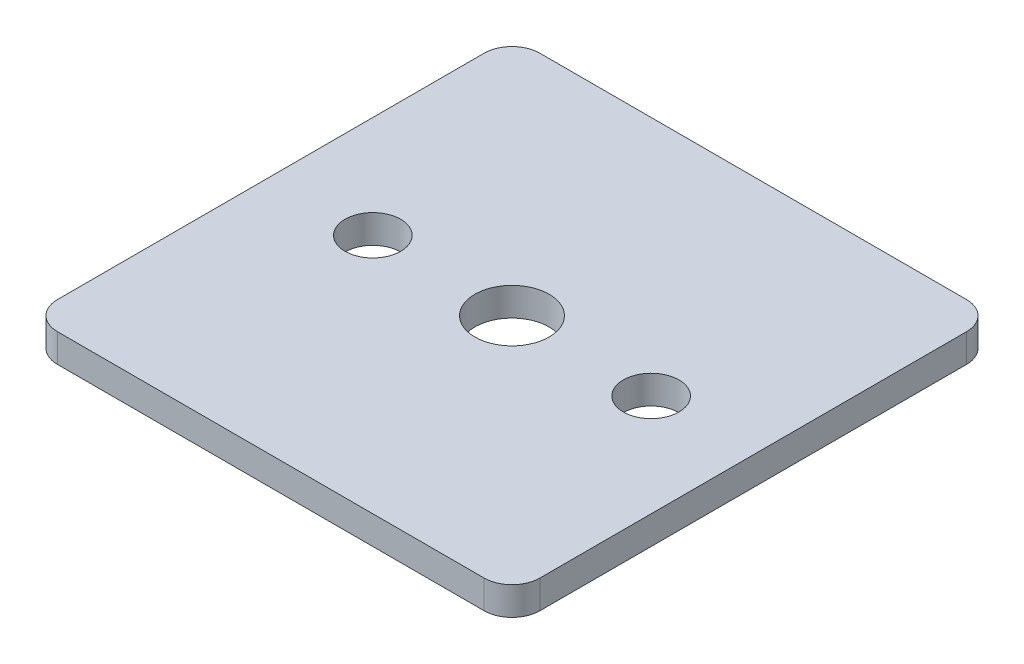
ISO-10303-21;
HEADER;
FILE_DESCRIPTION(('STEP AP214'),'2;1');
FILE_NAME('part.step','',(''),(''),'','','');
FILE_SCHEMA(('AUTOMOTIVE_DESIGN { 1 0 10303 214 1 1 1 1 }'));
ENDSEC;
DATA;
#1=APPLICATION_CONTEXT('core data for automotive mechanical design processes');
#2=APPLICATION_PROTOCOL_DEFINITION('international standard','automotive_design',2000,#1);
#3=PRODUCT_CONTEXT('',#1,'mechanical');
#4=PRODUCT('Part','Part','',(#3));
#5=PRODUCT_RELATED_PRODUCT_CATEGORY('part','',(#4));
#6=PRODUCT_DEFINITION_FORMATION('','',#4);
#7=PRODUCT_DEFINITION_CONTEXT('part definition',#1,'design');
#8=PRODUCT_DEFINITION('design','',#6,#7);
#9=PRODUCT_DEFINITION_SHAPE('','',#8);
#10=(LENGTH_UNIT() NAMED_UNIT(*) SI_UNIT(.MILLI.,.METRE.));
#11=(NAMED_UNIT(*) PLANE_ANGLE_UNIT() SI_UNIT($,.RADIAN.));
#12=(NAMED_UNIT(*) SI_UNIT($,.STERADIAN.) SOLID_ANGLE_UNIT());
#13=UNCERTAINTY_MEASURE_WITH_UNIT(LENGTH_MEASURE(1.E-05),#10,'distance_accuracy_value','');
#14=(GEOMETRIC_REPRESENTATION_CONTEXT(3) GLOBAL_UNCERTAINTY_ASSIGNED_CONTEXT((#13)) GLOBAL_UNIT_ASSIGNED_CONTEXT((#10,
#11,#12)) REPRESENTATION_CONTEXT('',''));
#15=CARTESIAN_POINT('',(0.,0.,0.));
#16=DIRECTION('',(0.,0.,1.));
#17=DIRECTION('',(1.,0.,0.));
#18=AXIS2_PLACEMENT_3D('',#15,#16,#17);
#19=CARTESIAN_POINT('',(0.,1.52943459614677,0.));
#20=DIRECTION('',(0.,-1.,0.));
#21=DIRECTION('',(0.,0.,-1.));
#22=AXIS2_PLACEMENT_3D('',#19,#20,#21);
#23=PLANE('',#22);
#24=CARTESIAN_POINT('',(-7.5,1.52943459614677,0.));
#25=DIRECTION('',(0.,1.,0.));
#26=DIRECTION('',(0.,0.,1.));
#27=AXIS2_PLACEMENT_3D('',#24,#25,#26);
#28=CIRCLE('',#27,1.5);
#29=CARTESIAN_POINT('',(-7.5,1.52943459614677,1.5));
#30=VERTEX_POINT('',#29);
#31=EDGE_CURVE('E181',#30,#30,#28,.T.);
#32=ORIENTED_EDGE('',*,*,#31,.F.);
#33=EDGE_LOOP('',(#32));
#34=FACE_BOUND('',#33,.T.);
#35=DIRECTION('',(1.,0.,0.));
#36=VECTOR('',#35,1.);
#37=CARTESIAN_POINT('',(13.,1.52943459614677,13.));
#38=LINE('',#37,#36);
#39=CARTESIAN_POINT('',(-11.5,1.52943459614677,13.));
#40=VERTEX_POINT('',#39);
#41=CARTESIAN_POINT('',(11.5,1.52943459614677,13.));
#42=VERTEX_POINT('',#41);
#43=EDGE_CURVE('E167',#40,#42,#38,.T.);
#44=ORIENTED_EDGE('',*,*,#43,.T.);
#45=CARTESIAN_POINT('',(11.5,1.52943459614677,11.5));
#46=DIRECTION('',(0.,-1.,0.));
#47=DIRECTION('',(0.,0.,-1.));
#48=AXIS2_PLACEMENT_3D('',#45,#46,#47);
#49=CIRCLE('',#48,1.5);
#50=CARTESIAN_POINT('',(13.,1.52943459614677,11.5));
#51=VERTEX_POINT('',#50);
#52=EDGE_CURVE('E148',#42,#51,#49,.F.);
#53=ORIENTED_EDGE('',*,*,#52,.T.);
#54=DIRECTION('',(0.,0.,-1.));
#55=VECTOR('',#54,1.);
#56=CARTESIAN_POINT('',(13.,1.52943459614677,-13.));
#57=LINE('',#56,#55);
#58=CARTESIAN_POINT('',(13.,1.52943459614677,-11.5));
#59=VERTEX_POINT('',#58);
#60=EDGE_CURVE('E118',#51,#59,#57,.T.);
#61=ORIENTED_EDGE('',*,*,#60,.T.);
#62=CARTESIAN_POINT('',(11.5,1.52943459614677,-11.5));
#63=DIRECTION('',(0.,-1.,0.));
#64=DIRECTION('',(0.,0.,-1.));
#65=AXIS2_PLACEMENT_3D('',#62,#63,#64);
#66=CIRCLE('',#65,1.5);
#67=CARTESIAN_POINT('',(11.5,1.52943459614677,-13.));
#68=VERTEX_POINT('',#67);
#69=EDGE_CURVE('E54',#59,#68,#66,.F.);
#70=ORIENTED_EDGE('',*,*,#69,.T.);
#71=DIRECTION('',(-1.,0.,0.));
#72=VECTOR('',#71,1.);
#73=CARTESIAN_POINT('',(-13.,1.52943459614677,-13.));
#74=LINE('',#73,#72);
#75=CARTESIAN_POINT('',(-11.5,1.52943459614677,-13.));
#76=VERTEX_POINT('',#75);
#77=EDGE_CURVE('E134',#68,#76,#74,.T.);
#78=ORIENTED_EDGE('',*,*,#77,.T.);
#79=CARTESIAN_POINT('',(-11.5,1.52943459614677,-11.5));
#80=DIRECTION('',(0.,-1.,0.));
#81=DIRECTION('',(0.,0.,-1.));
#82=AXIS2_PLACEMENT_3D('',#79,#80,#81);
#83=CIRCLE('',#82,1.5);
#84=CARTESIAN_POINT('',(-13.,1.52943459614677,-11.5));
#85=VERTEX_POINT('',#84);
#86=EDGE_CURVE('E145',#76,#85,#83,.F.);
#87=ORIENTED_EDGE('',*,*,#86,.T.);
#88=DIRECTION('',(0.,0.,1.));
#89=VECTOR('',#88,1.);
#90=CARTESIAN_POINT('',(-13.,1.52943459614677,13.));
#91=LINE('',#90,#89);
#92=CARTESIAN_POINT('',(-13.,1.52943459614677,11.5));
#93=VERTEX_POINT('',#92);
#94=EDGE_CURVE('E128',#85,#93,#91,.T.);
#95=ORIENTED_EDGE('',*,*,#94,.T.);
#96=CARTESIAN_POINT('',(-11.5,1.52943459614677,11.5));
#97=DIRECTION('',(0.,-1.,0.));
#98=DIRECTION('',(0.,0.,-1.));
#99=AXIS2_PLACEMENT_3D('',#96,#97,#98);
#100=CIRCLE('',#99,1.5);
#101=EDGE_CURVE('E143',#93,#40,#100,.F.);
#102=ORIENTED_EDGE('',*,*,#101,.T.);
#103=EDGE_LOOP('',(#44,#53,#61,#70,#78,#87,#95,#102));
#104=FACE_BOUND('',#103,.T.);
#105=CARTESIAN_POINT('',(7.5,1.52943459614677,0.));
#106=DIRECTION('',(0.,1.,0.));
#107=DIRECTION('',(0.,0.,1.));
#108=AXIS2_PLACEMENT_3D('',#105,#106,#107);
#109=CIRCLE('',#108,1.5);
#110=CARTESIAN_POINT('',(7.5,1.52943459614677,1.5));
#111=VERTEX_POINT('',#110);
#112=EDGE_CURVE('E172',#111,#111,#109,.T.);
#113=ORIENTED_EDGE('',*,*,#112,.F.);
#114=EDGE_LOOP('',(#113));
#115=FACE_BOUND('',#114,.T.);
#116=CARTESIAN_POINT('',(0.,1.52943459614677,0.));
#117=DIRECTION('',(0.,1.,0.));
#118=DIRECTION('',(0.,0.,1.));
#119=AXIS2_PLACEMENT_3D('',#116,#117,#118);
#120=CIRCLE('',#119,2.);
#121=CARTESIAN_POINT('',(0.,1.52943459614677,2.));
#122=VERTEX_POINT('',#121);
#123=EDGE_CURVE('E186',#122,#122,#120,.T.);
#124=ORIENTED_EDGE('',*,*,#123,.F.);
#125=EDGE_LOOP('',(#124));
#126=FACE_BOUND('',#125,.T.);
#127=ADVANCED_FACE('F32',(#34,#104,#115,#126),#23,.F.);
#128=CARTESIAN_POINT('',(0.,0.,0.));
#129=DIRECTION('',(0.,-1.,0.));
#130=DIRECTION('',(0.,0.,-1.));
#131=AXIS2_PLACEMENT_3D('',#128,#129,#130);
#132=PLANE('',#131);
#133=CARTESIAN_POINT('',(-7.5,0.,0.));
#134=DIRECTION('',(0.,1.,0.));
#135=DIRECTION('',(0.,0.,1.));
#136=AXIS2_PLACEMENT_3D('',#133,#134,#135);
#137=CIRCLE('',#136,1.5);
#138=CARTESIAN_POINT('',(-7.5,0.,1.5));
#139=VERTEX_POINT('',#138);
#140=EDGE_CURVE('E183',#139,#139,#137,.T.);
#141=ORIENTED_EDGE('',*,*,#140,.T.);
#142=EDGE_LOOP('',(#141));
#143=FACE_BOUND('',#142,.T.);
#144=DIRECTION('',(0.,0.,-1.));
#145=VECTOR('',#144,1.);
#146=CARTESIAN_POINT('',(13.,0.,-13.));
#147=LINE('',#146,#145);
#148=CARTESIAN_POINT('',(13.,0.,11.5));
#149=VERTEX_POINT('',#148);
#150=CARTESIAN_POINT('',(13.,0.,-11.5));
#151=VERTEX_POINT('',#150);
#152=EDGE_CURVE('E116',#149,#151,#147,.T.);
#153=ORIENTED_EDGE('',*,*,#152,.F.);
#154=CARTESIAN_POINT('',(11.5,0.,11.5));
#155=DIRECTION('',(0.,-1.,0.));
#156=DIRECTION('',(0.,0.,-1.));
#157=AXIS2_PLACEMENT_3D('',#154,#155,#156);
#158=CIRCLE('',#157,1.5);
#159=CARTESIAN_POINT('',(11.5,0.,13.));
#160=VERTEX_POINT('',#159);
#161=EDGE_CURVE('E99',#149,#160,#158,.T.);
#162=ORIENTED_EDGE('',*,*,#161,.T.);
#163=DIRECTION('',(1.,0.,0.));
#164=VECTOR('',#163,1.);
#165=CARTESIAN_POINT('',(13.,0.,13.));
#166=LINE('',#165,#164);
#167=CARTESIAN_POINT('',(-11.5,0.,13.));
#168=VERTEX_POINT('',#167);
#169=EDGE_CURVE('E126',#168,#160,#166,.T.);
#170=ORIENTED_EDGE('',*,*,#169,.F.);
#171=CARTESIAN_POINT('',(-11.5,0.,11.5));
#172=DIRECTION('',(0.,-1.,0.));
#173=DIRECTION('',(0.,0.,-1.));
#174=AXIS2_PLACEMENT_3D('',#171,#172,#173);
#175=CIRCLE('',#174,1.5);
#176=CARTESIAN_POINT('',(-13.,0.,11.5));
#177=VERTEX_POINT('',#176);
#178=EDGE_CURVE('E119',#168,#177,#175,.T.);
#179=ORIENTED_EDGE('',*,*,#178,.T.);
#180=DIRECTION('',(0.,0.,1.));
#181=VECTOR('',#180,1.);
#182=CARTESIAN_POINT('',(-13.,0.,13.));
#183=LINE('',#182,#181);
#184=CARTESIAN_POINT('',(-13.,0.,-11.5));
#185=VERTEX_POINT('',#184);
#186=EDGE_CURVE('E130',#185,#177,#183,.T.);
#187=ORIENTED_EDGE('',*,*,#186,.F.);
#188=CARTESIAN_POINT('',(-11.5,0.,-11.5));
#189=DIRECTION('',(0.,-1.,0.));
#190=DIRECTION('',(0.,0.,-1.));
#191=AXIS2_PLACEMENT_3D('',#188,#189,#190);
#192=CIRCLE('',#191,1.5);
#193=CARTESIAN_POINT('',(-11.5,0.,-13.));
#194=VERTEX_POINT('',#193);
#195=EDGE_CURVE('E137',#185,#194,#192,.T.);
#196=ORIENTED_EDGE('',*,*,#195,.T.);
#197=DIRECTION('',(-1.,0.,0.));
#198=VECTOR('',#197,1.);
#199=CARTESIAN_POINT('',(-13.,0.,-13.));
#200=LINE('',#199,#198);
#201=CARTESIAN_POINT('',(11.5,0.,-13.));
#202=VERTEX_POINT('',#201);
#203=EDGE_CURVE('E125',#202,#194,#200,.T.);
#204=ORIENTED_EDGE('',*,*,#203,.F.);
#205=CARTESIAN_POINT('',(11.5,0.,-11.5));
#206=DIRECTION('',(0.,-1.,0.));
#207=DIRECTION('',(0.,0.,-1.));
#208=AXIS2_PLACEMENT_3D('',#205,#206,#207);
#209=CIRCLE('',#208,1.5);
#210=EDGE_CURVE('E110',#202,#151,#209,.T.);
#211=ORIENTED_EDGE('',*,*,#210,.T.);
#212=EDGE_LOOP('',(#153,#162,#170,#179,#187,#196,#204,#211));
#213=FACE_BOUND('',#212,.T.);
#214=CARTESIAN_POINT('',(7.5,0.,0.));
#215=DIRECTION('',(0.,1.,0.));
#216=DIRECTION('',(0.,0.,1.));
#217=AXIS2_PLACEMENT_3D('',#214,#215,#216);
#218=CIRCLE('',#217,1.5);
#219=CARTESIAN_POINT('',(7.5,0.,1.5));
#220=VERTEX_POINT('',#219);
#221=EDGE_CURVE('E174',#220,#220,#218,.T.);
#222=ORIENTED_EDGE('',*,*,#221,.T.);
#223=EDGE_LOOP('',(#222));
#224=FACE_BOUND('',#223,.T.);
#225=CARTESIAN_POINT('',(0.,0.,0.));
#226=DIRECTION('',(0.,1.,0.));
#227=DIRECTION('',(0.,0.,1.));
#228=AXIS2_PLACEMENT_3D('',#225,#226,#227);
#229=CIRCLE('',#228,2.);
#230=CARTESIAN_POINT('',(0.,0.,2.));
#231=VERTEX_POINT('',#230);
#232=EDGE_CURVE('E189',#231,#231,#229,.T.);
#233=ORIENTED_EDGE('',*,*,#232,.T.);
#234=EDGE_LOOP('',(#233));
#235=FACE_BOUND('',#234,.T.);
#236=ADVANCED_FACE('F122',(#143,#213,#224,#235),#132,.T.);
#237=CARTESIAN_POINT('',(-13.,1.52943459614677,13.));
#238=DIRECTION('',(1.,0.,0.));
#239=DIRECTION('',(0.,0.,-1.));
#240=AXIS2_PLACEMENT_3D('',#237,#238,#239);
#241=PLANE('',#240);
#242=ORIENTED_EDGE('',*,*,#94,.F.);
#243=DIRECTION('',(0.,-1.,0.));
#244=VECTOR('',#243,1.);
#245=CARTESIAN_POINT('',(-13.,1.52943459614677,-11.5));
#246=LINE('',#245,#244);
#247=EDGE_CURVE('E11',#85,#185,#246,.T.);
#248=ORIENTED_EDGE('',*,*,#247,.T.);
#249=ORIENTED_EDGE('',*,*,#186,.T.);
#250=DIRECTION('',(0.,-1.,0.));
#251=VECTOR('',#250,1.);
#252=CARTESIAN_POINT('',(-13.,1.52943459614677,11.5));
#253=LINE('',#252,#251);
#254=EDGE_CURVE('E40',#177,#93,#253,.F.);
#255=ORIENTED_EDGE('',*,*,#254,.T.);
#256=EDGE_LOOP('',(#242,#248,#249,#255));
#257=FACE_BOUND('',#256,.T.);
#258=ADVANCED_FACE('F158',(#257),#241,.F.);
#259=CARTESIAN_POINT('',(13.,1.52943459614677,13.));
#260=DIRECTION('',(0.,0.,-1.));
#261=DIRECTION('',(-1.,0.,0.));
#262=AXIS2_PLACEMENT_3D('',#259,#260,#261);
#263=PLANE('',#262);
#264=ORIENTED_EDGE('',*,*,#169,.T.);
#265=DIRECTION('',(0.,-1.,0.));
#266=VECTOR('',#265,1.);
#267=CARTESIAN_POINT('',(11.5,1.52943459614677,13.));
#268=LINE('',#267,#266);
#269=EDGE_CURVE('E104',#160,#42,#268,.F.);
#270=ORIENTED_EDGE('',*,*,#269,.T.);
#271=ORIENTED_EDGE('',*,*,#43,.F.);
#272=DIRECTION('',(0.,-1.,0.));
#273=VECTOR('',#272,1.);
#274=CARTESIAN_POINT('',(-11.5,1.52943459614677,13.));
#275=LINE('',#274,#273);
#276=EDGE_CURVE('E109',#40,#168,#275,.T.);
#277=ORIENTED_EDGE('',*,*,#276,.T.);
#278=EDGE_LOOP('',(#264,#270,#271,#277));
#279=FACE_BOUND('',#278,.T.);
#280=ADVANCED_FACE('F171',(#279),#263,.F.);
#281=CARTESIAN_POINT('',(13.,1.52943459614677,-13.));
#282=DIRECTION('',(-1.,0.,0.));
#283=DIRECTION('',(0.,0.,1.));
#284=AXIS2_PLACEMENT_3D('',#281,#282,#283);
#285=PLANE('',#284);
#286=ORIENTED_EDGE('',*,*,#60,.F.);
#287=DIRECTION('',(0.,-1.,0.));
#288=VECTOR('',#287,1.);
#289=CARTESIAN_POINT('',(13.,1.52943459614677,11.5));
#290=LINE('',#289,#288);
#291=EDGE_CURVE('E103',#51,#149,#290,.T.);
#292=ORIENTED_EDGE('',*,*,#291,.T.);
#293=ORIENTED_EDGE('',*,*,#152,.T.);
#294=DIRECTION('',(0.,-1.,0.));
#295=VECTOR('',#294,1.);
#296=CARTESIAN_POINT('',(13.,1.52943459614677,-11.5));
#297=LINE('',#296,#295);
#298=EDGE_CURVE('E120',#151,#59,#297,.F.);
#299=ORIENTED_EDGE('',*,*,#298,.T.);
#300=EDGE_LOOP('',(#286,#292,#293,#299));
#301=FACE_BOUND('',#300,.T.);
#302=ADVANCED_FACE('F115',(#301),#285,.F.);
#303=CARTESIAN_POINT('',(-13.,1.52943459614677,-13.));
#304=DIRECTION('',(0.,0.,1.));
#305=DIRECTION('',(1.,0.,0.));
#306=AXIS2_PLACEMENT_3D('',#303,#304,#305);
#307=PLANE('',#306);
#308=ORIENTED_EDGE('',*,*,#77,.F.);
#309=DIRECTION('',(0.,-1.,0.));
#310=VECTOR('',#309,1.);
#311=CARTESIAN_POINT('',(11.5,1.52943459614677,-13.));
#312=LINE('',#311,#310);
#313=EDGE_CURVE('E151',#68,#202,#312,.T.);
#314=ORIENTED_EDGE('',*,*,#313,.T.);
#315=ORIENTED_EDGE('',*,*,#203,.T.);
#316=DIRECTION('',(0.,-1.,0.));
#317=VECTOR('',#316,1.);
#318=CARTESIAN_POINT('',(-11.5,1.52943459614677,-13.));
#319=LINE('',#318,#317);
#320=EDGE_CURVE('E47',#194,#76,#319,.F.);
#321=ORIENTED_EDGE('',*,*,#320,.T.);
#322=EDGE_LOOP('',(#308,#314,#315,#321));
#323=FACE_BOUND('',#322,.T.);
#324=ADVANCED_FACE('F211',(#323),#307,.F.);
#325=CARTESIAN_POINT('',(7.5,1.52943459614677,0.));
#326=DIRECTION('',(0.,-1.,0.));
#327=DIRECTION('',(0.,0.,-1.));
#328=AXIS2_PLACEMENT_3D('',#325,#326,#327);
#329=CYLINDRICAL_SURFACE('',#328,1.5);
#330=ORIENTED_EDGE('',*,*,#112,.T.);
#331=EDGE_LOOP('',(#330));
#332=FACE_BOUND('',#331,.T.);
#333=ORIENTED_EDGE('',*,*,#221,.F.);
#334=EDGE_LOOP('',(#333));
#335=FACE_BOUND('',#334,.T.);
#336=ADVANCED_FACE('F208',(#332,#335),#329,.F.);
#337=CARTESIAN_POINT('',(-7.5,1.52943459614677,0.));
#338=DIRECTION('',(0.,-1.,0.));
#339=DIRECTION('',(0.,0.,-1.));
#340=AXIS2_PLACEMENT_3D('',#337,#338,#339);
#341=CYLINDRICAL_SURFACE('',#340,1.5);
#342=ORIENTED_EDGE('',*,*,#31,.T.);
#343=EDGE_LOOP('',(#342));
#344=FACE_BOUND('',#343,.T.);
#345=ORIENTED_EDGE('',*,*,#140,.F.);
#346=EDGE_LOOP('',(#345));
#347=FACE_BOUND('',#346,.T.);
#348=ADVANCED_FACE('F294',(#344,#347),#341,.F.);
#349=CARTESIAN_POINT('',(0.,1.52943459614677,0.));
#350=DIRECTION('',(0.,-1.,0.));
#351=DIRECTION('',(0.,0.,-1.));
#352=AXIS2_PLACEMENT_3D('',#349,#350,#351);
#353=CYLINDRICAL_SURFACE('',#352,2.);
#354=ORIENTED_EDGE('',*,*,#123,.T.);
#355=EDGE_LOOP('',(#354));
#356=FACE_BOUND('',#355,.T.);
#357=ORIENTED_EDGE('',*,*,#232,.F.);
#358=EDGE_LOOP('',(#357));
#359=FACE_BOUND('',#358,.T.);
#360=ADVANCED_FACE('F195',(#356,#359),#353,.F.);
#361=CARTESIAN_POINT('',(11.5,1.52943459614677,11.5));
#362=DIRECTION('',(0.,-1.,0.));
#363=DIRECTION('',(0.,0.,-1.));
#364=AXIS2_PLACEMENT_3D('',#361,#362,#363);
#365=CYLINDRICAL_SURFACE('',#364,1.5);
#366=ORIENTED_EDGE('',*,*,#52,.F.);
#367=ORIENTED_EDGE('',*,*,#269,.F.);
#368=ORIENTED_EDGE('',*,*,#161,.F.);
#369=ORIENTED_EDGE('',*,*,#291,.F.);
#370=EDGE_LOOP('',(#366,#367,#368,#369));
#371=FACE_BOUND('',#370,.T.);
#372=ADVANCED_FACE('F102',(#371),#365,.T.);
#373=CARTESIAN_POINT('',(11.5,1.52943459614677,-11.5));
#374=DIRECTION('',(0.,-1.,0.));
#375=DIRECTION('',(0.,0.,-1.));
#376=AXIS2_PLACEMENT_3D('',#373,#374,#375);
#377=CYLINDRICAL_SURFACE('',#376,1.5);
#378=ORIENTED_EDGE('',*,*,#69,.F.);
#379=ORIENTED_EDGE('',*,*,#298,.F.);
#380=ORIENTED_EDGE('',*,*,#210,.F.);
#381=ORIENTED_EDGE('',*,*,#313,.F.);
#382=EDGE_LOOP('',(#378,#379,#380,#381));
#383=FACE_BOUND('',#382,.T.);
#384=ADVANCED_FACE('F222',(#383),#377,.T.);
#385=CARTESIAN_POINT('',(-11.5,1.52943459614677,-11.5));
#386=DIRECTION('',(0.,-1.,0.));
#387=DIRECTION('',(0.,0.,-1.));
#388=AXIS2_PLACEMENT_3D('',#385,#386,#387);
#389=CYLINDRICAL_SURFACE('',#388,1.5);
#390=ORIENTED_EDGE('',*,*,#86,.F.);
#391=ORIENTED_EDGE('',*,*,#320,.F.);
#392=ORIENTED_EDGE('',*,*,#195,.F.);
#393=ORIENTED_EDGE('',*,*,#247,.F.);
#394=EDGE_LOOP('',(#390,#391,#392,#393));
#395=FACE_BOUND('',#394,.T.);
#396=ADVANCED_FACE('F224',(#395),#389,.T.);
#397=CARTESIAN_POINT('',(-11.5,1.52943459614677,11.5));
#398=DIRECTION('',(0.,-1.,0.));
#399=DIRECTION('',(0.,0.,-1.));
#400=AXIS2_PLACEMENT_3D('',#397,#398,#399);
#401=CYLINDRICAL_SURFACE('',#400,1.5);
#402=ORIENTED_EDGE('',*,*,#101,.F.);
#403=ORIENTED_EDGE('',*,*,#254,.F.);
#404=ORIENTED_EDGE('',*,*,#178,.F.);
#405=ORIENTED_EDGE('',*,*,#276,.F.);
#406=EDGE_LOOP('',(#402,#403,#404,#405));
#407=FACE_BOUND('',#406,.T.);
#408=ADVANCED_FACE('F34',(#407),#401,.T.);
#409=CLOSED_SHELL('',(#127,#236,#258,#280,#302,#324,#336,#348,#360,#372,#384,#396,#408));
#410=MANIFOLD_SOLID_BREP('B2',#409);
#411=ADVANCED_BREP_SHAPE_REPRESENTATION('',(#18,#410),#14);
#412=SHAPE_DEFINITION_REPRESENTATION(#9,#411);
ENDSEC;
END-ISO-10303-21;
